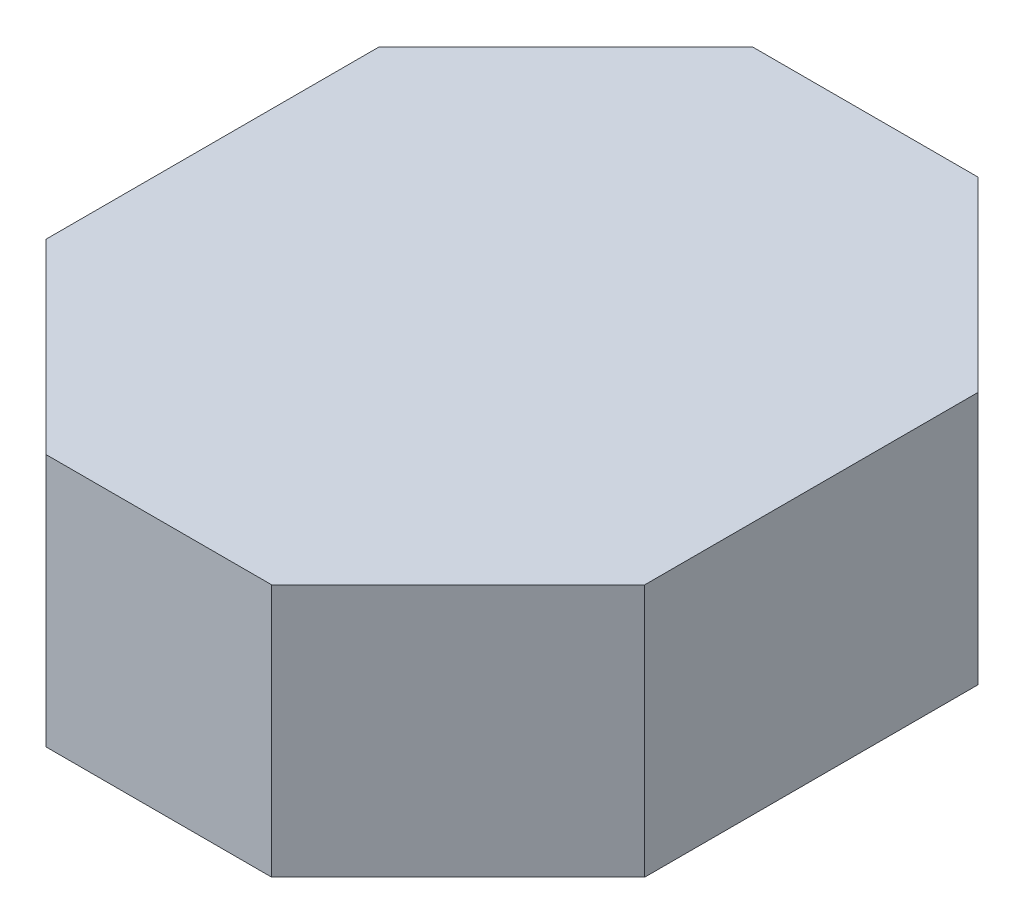
ISO-10303-21;
HEADER;
FILE_DESCRIPTION(('STEP AP214'),'2;1');
FILE_NAME('part.step','',(''),(''),'','','');
FILE_SCHEMA(('AUTOMOTIVE_DESIGN { 1 0 10303 214 1 1 1 1 }'));
ENDSEC;
DATA;
#1=APPLICATION_CONTEXT('core data for automotive mechanical design processes');
#2=APPLICATION_PROTOCOL_DEFINITION('international standard','automotive_design',2000,#1);
#3=PRODUCT_CONTEXT('',#1,'mechanical');
#4=PRODUCT('Part','Part','',(#3));
#5=PRODUCT_RELATED_PRODUCT_CATEGORY('part','',(#4));
#6=PRODUCT_DEFINITION_FORMATION('','',#4);
#7=PRODUCT_DEFINITION_CONTEXT('part definition',#1,'design');
#8=PRODUCT_DEFINITION('design','',#6,#7);
#9=PRODUCT_DEFINITION_SHAPE('','',#8);
#10=(LENGTH_UNIT() NAMED_UNIT(*) SI_UNIT(.MILLI.,.METRE.));
#11=(NAMED_UNIT(*) PLANE_ANGLE_UNIT() SI_UNIT($,.RADIAN.));
#12=(NAMED_UNIT(*) SI_UNIT($,.STERADIAN.) SOLID_ANGLE_UNIT());
#13=UNCERTAINTY_MEASURE_WITH_UNIT(LENGTH_MEASURE(1.E-05),#10,'distance_accuracy_value','');
#14=(GEOMETRIC_REPRESENTATION_CONTEXT(3) GLOBAL_UNCERTAINTY_ASSIGNED_CONTEXT((#13)) GLOBAL_UNIT_ASSIGNED_CONTEXT((#10,
#11,#12)) REPRESENTATION_CONTEXT('',''));
#15=CARTESIAN_POINT('',(0.,0.,0.));
#16=DIRECTION('',(0.,0.,1.));
#17=DIRECTION('',(1.,0.,0.));
#18=AXIS2_PLACEMENT_3D('',#15,#16,#17);
#19=CARTESIAN_POINT('',(69.6568542494926,80.,219.137084989847));
#20=DIRECTION('',(0.,0.,1.));
#21=DIRECTION('',(1.,0.,0.));
#22=AXIS2_PLACEMENT_3D('',#19,#20,#21);
#23=PLANE('',#22);
#24=DIRECTION('',(-1.,0.,0.));
#25=VECTOR('',#24,1.);
#26=CARTESIAN_POINT('',(69.6568542494926,0.,219.137084989847));
#27=LINE('',#26,#25);
#28=CARTESIAN_POINT('',(69.6568542494926,0.,219.137084989847));
#29=VERTEX_POINT('',#28);
#30=CARTESIAN_POINT('',(-1.65685424949194,0.,219.137084989847));
#31=VERTEX_POINT('',#30);
#32=EDGE_CURVE('E158',#29,#31,#27,.T.);
#33=ORIENTED_EDGE('',*,*,#32,.F.);
#34=DIRECTION('',(0.,-1.,0.));
#35=VECTOR('',#34,1.);
#36=CARTESIAN_POINT('',(69.6568542494926,80.,219.137084989847));
#37=LINE('',#36,#35);
#38=CARTESIAN_POINT('',(69.6568542494926,80.,219.137084989847));
#39=VERTEX_POINT('',#38);
#40=EDGE_CURVE('E11',#39,#29,#37,.T.);
#41=ORIENTED_EDGE('',*,*,#40,.F.);
#42=DIRECTION('',(-1.,0.,0.));
#43=VECTOR('',#42,1.);
#44=CARTESIAN_POINT('',(69.6568542494926,80.,219.137084989847));
#45=LINE('',#44,#43);
#46=CARTESIAN_POINT('',(-1.65685424949194,80.,219.137084989847));
#47=VERTEX_POINT('',#46);
#48=EDGE_CURVE('E187',#39,#47,#45,.T.);
#49=ORIENTED_EDGE('',*,*,#48,.T.);
#50=DIRECTION('',(0.,-1.,0.));
#51=VECTOR('',#50,1.);
#52=CARTESIAN_POINT('',(-1.65685424949194,80.,219.137084989847));
#53=LINE('',#52,#51);
#54=EDGE_CURVE('E45',#47,#31,#53,.T.);
#55=ORIENTED_EDGE('',*,*,#54,.T.);
#56=EDGE_LOOP('',(#33,#41,#49,#55));
#57=FACE_BOUND('',#56,.T.);
#58=ADVANCED_FACE('F42',(#57),#23,.T.);
#59=CARTESIAN_POINT('',(128.568542494924,80.,160.225396744416));
#60=DIRECTION('',(0.707106781186548,0.,0.707106781186548));
#61=DIRECTION('',(0.707106781186548,0.,-0.707106781186548));
#62=AXIS2_PLACEMENT_3D('',#59,#60,#61);
#63=PLANE('',#62);
#64=DIRECTION('',(-0.707106781186547,0.,0.707106781186547));
#65=VECTOR('',#64,1.);
#66=CARTESIAN_POINT('',(128.568542494924,0.,160.225396744416));
#67=LINE('',#66,#65);
#68=CARTESIAN_POINT('',(128.568542494924,0.,160.225396744416));
#69=VERTEX_POINT('',#68);
#70=EDGE_CURVE('E184',#69,#29,#67,.T.);
#71=ORIENTED_EDGE('',*,*,#70,.F.);
#72=DIRECTION('',(0.,-1.,0.));
#73=VECTOR('',#72,1.);
#74=CARTESIAN_POINT('',(128.568542494924,80.,160.225396744416));
#75=LINE('',#74,#73);
#76=CARTESIAN_POINT('',(128.568542494924,80.,160.225396744416));
#77=VERTEX_POINT('',#76);
#78=EDGE_CURVE('E51',#77,#69,#75,.T.);
#79=ORIENTED_EDGE('',*,*,#78,.F.);
#80=DIRECTION('',(-0.707106781186547,0.,0.707106781186547));
#81=VECTOR('',#80,1.);
#82=CARTESIAN_POINT('',(128.568542494924,80.,160.225396744416));
#83=LINE('',#82,#81);
#84=EDGE_CURVE('E144',#77,#39,#83,.T.);
#85=ORIENTED_EDGE('',*,*,#84,.T.);
#86=ORIENTED_EDGE('',*,*,#40,.T.);
#87=EDGE_LOOP('',(#71,#79,#85,#86));
#88=FACE_BOUND('',#87,.T.);
#89=ADVANCED_FACE('F205',(#88),#63,.T.);
#90=CARTESIAN_POINT('',(128.568542494924,80.,54.9116882454311));
#91=DIRECTION('',(1.,0.,0.));
#92=DIRECTION('',(0.,0.,-1.));
#93=AXIS2_PLACEMENT_3D('',#90,#91,#92);
#94=PLANE('',#93);
#95=DIRECTION('',(0.,0.,1.));
#96=VECTOR('',#95,1.);
#97=CARTESIAN_POINT('',(128.568542494924,0.,54.9116882454311));
#98=LINE('',#97,#96);
#99=CARTESIAN_POINT('',(128.568542494924,0.,54.9116882454311));
#100=VERTEX_POINT('',#99);
#101=EDGE_CURVE('E130',#100,#69,#98,.T.);
#102=ORIENTED_EDGE('',*,*,#101,.F.);
#103=DIRECTION('',(0.,-1.,0.));
#104=VECTOR('',#103,1.);
#105=CARTESIAN_POINT('',(128.568542494924,80.,54.9116882454311));
#106=LINE('',#105,#104);
#107=CARTESIAN_POINT('',(128.568542494924,80.,54.9116882454311));
#108=VERTEX_POINT('',#107);
#109=EDGE_CURVE('E124',#108,#100,#106,.T.);
#110=ORIENTED_EDGE('',*,*,#109,.F.);
#111=DIRECTION('',(0.,0.,1.));
#112=VECTOR('',#111,1.);
#113=CARTESIAN_POINT('',(128.568542494924,80.,54.9116882454311));
#114=LINE('',#113,#112);
#115=EDGE_CURVE('E127',#108,#77,#114,.T.);
#116=ORIENTED_EDGE('',*,*,#115,.T.);
#117=ORIENTED_EDGE('',*,*,#78,.T.);
#118=EDGE_LOOP('',(#102,#110,#116,#117));
#119=FACE_BOUND('',#118,.T.);
#120=ADVANCED_FACE('F126',(#119),#94,.T.);
#121=CARTESIAN_POINT('',(69.6568542494924,80.,-4.));
#122=DIRECTION('',(0.707106781186544,0.,-0.707106781186551));
#123=DIRECTION('',(-0.707106781186551,0.,-0.707106781186544));
#124=AXIS2_PLACEMENT_3D('',#121,#122,#123);
#125=PLANE('',#124);
#126=DIRECTION('',(0.707106781186551,0.,0.707106781186544));
#127=VECTOR('',#126,1.);
#128=CARTESIAN_POINT('',(69.6568542494924,0.,-4.));
#129=LINE('',#128,#127);
#130=CARTESIAN_POINT('',(69.6568542494924,0.,-4.));
#131=VERTEX_POINT('',#130);
#132=EDGE_CURVE('E179',#131,#100,#129,.T.);
#133=ORIENTED_EDGE('',*,*,#132,.F.);
#134=DIRECTION('',(0.,-1.,0.));
#135=VECTOR('',#134,1.);
#136=CARTESIAN_POINT('',(69.6568542494924,80.,-4.));
#137=LINE('',#136,#135);
#138=CARTESIAN_POINT('',(69.6568542494924,80.,-4.));
#139=VERTEX_POINT('',#138);
#140=EDGE_CURVE('E136',#139,#131,#137,.T.);
#141=ORIENTED_EDGE('',*,*,#140,.F.);
#142=DIRECTION('',(0.707106781186551,0.,0.707106781186544));
#143=VECTOR('',#142,1.);
#144=CARTESIAN_POINT('',(69.6568542494924,80.,-4.));
#145=LINE('',#144,#143);
#146=EDGE_CURVE('E142',#139,#108,#145,.T.);
#147=ORIENTED_EDGE('',*,*,#146,.T.);
#148=ORIENTED_EDGE('',*,*,#109,.T.);
#149=EDGE_LOOP('',(#133,#141,#147,#148));
#150=FACE_BOUND('',#149,.T.);
#151=ADVANCED_FACE('F147',(#150),#125,.T.);
#152=CARTESIAN_POINT('',(-1.65685424949214,80.,-4.));
#153=DIRECTION('',(0.,0.,-1.));
#154=DIRECTION('',(-1.,0.,0.));
#155=AXIS2_PLACEMENT_3D('',#152,#153,#154);
#156=PLANE('',#155);
#157=DIRECTION('',(1.,0.,0.));
#158=VECTOR('',#157,1.);
#159=CARTESIAN_POINT('',(-1.65685424949214,0.,-4.));
#160=LINE('',#159,#158);
#161=CARTESIAN_POINT('',(-1.65685424949214,0.,-4.));
#162=VERTEX_POINT('',#161);
#163=EDGE_CURVE('E175',#162,#131,#160,.T.);
#164=ORIENTED_EDGE('',*,*,#163,.F.);
#165=DIRECTION('',(0.,-1.,0.));
#166=VECTOR('',#165,1.);
#167=CARTESIAN_POINT('',(-1.65685424949214,80.,-4.));
#168=LINE('',#167,#166);
#169=CARTESIAN_POINT('',(-1.65685424949214,80.,-4.));
#170=VERTEX_POINT('',#169);
#171=EDGE_CURVE('E193',#170,#162,#168,.T.);
#172=ORIENTED_EDGE('',*,*,#171,.F.);
#173=DIRECTION('',(1.,0.,0.));
#174=VECTOR('',#173,1.);
#175=CARTESIAN_POINT('',(-1.65685424949214,80.,-4.));
#176=LINE('',#175,#174);
#177=EDGE_CURVE('E149',#170,#139,#176,.T.);
#178=ORIENTED_EDGE('',*,*,#177,.T.);
#179=ORIENTED_EDGE('',*,*,#140,.T.);
#180=EDGE_LOOP('',(#164,#172,#178,#179));
#181=FACE_BOUND('',#180,.T.);
#182=ADVANCED_FACE('F218',(#181),#156,.T.);
#183=CARTESIAN_POINT('',(-60.5685424949237,80.,54.9116882454315));
#184=DIRECTION('',(-0.707106781186547,0.,-0.707106781186548));
#185=DIRECTION('',(-0.707106781186548,0.,0.707106781186547));
#186=AXIS2_PLACEMENT_3D('',#183,#184,#185);
#187=PLANE('',#186);
#188=DIRECTION('',(0.707106781186548,0.,-0.707106781186547));
#189=VECTOR('',#188,1.);
#190=CARTESIAN_POINT('',(-60.5685424949237,0.,54.9116882454315));
#191=LINE('',#190,#189);
#192=CARTESIAN_POINT('',(-60.5685424949237,0.,54.9116882454315));
#193=VERTEX_POINT('',#192);
#194=EDGE_CURVE('E171',#193,#162,#191,.T.);
#195=ORIENTED_EDGE('',*,*,#194,.F.);
#196=DIRECTION('',(0.,-1.,0.));
#197=VECTOR('',#196,1.);
#198=CARTESIAN_POINT('',(-60.5685424949237,80.,54.9116882454315));
#199=LINE('',#198,#197);
#200=CARTESIAN_POINT('',(-60.5685424949237,80.,54.9116882454315));
#201=VERTEX_POINT('',#200);
#202=EDGE_CURVE('E196',#201,#193,#199,.T.);
#203=ORIENTED_EDGE('',*,*,#202,.F.);
#204=DIRECTION('',(0.707106781186548,0.,-0.707106781186547));
#205=VECTOR('',#204,1.);
#206=CARTESIAN_POINT('',(-60.5685424949237,80.,54.9116882454315));
#207=LINE('',#206,#205);
#208=EDGE_CURVE('E152',#201,#170,#207,.T.);
#209=ORIENTED_EDGE('',*,*,#208,.T.);
#210=ORIENTED_EDGE('',*,*,#171,.T.);
#211=EDGE_LOOP('',(#195,#203,#209,#210));
#212=FACE_BOUND('',#211,.T.);
#213=ADVANCED_FACE('F221',(#212),#187,.T.);
#214=CARTESIAN_POINT('',(-60.5685424949237,80.,160.225396744416));
#215=DIRECTION('',(-1.,0.,0.));
#216=DIRECTION('',(0.,0.,1.));
#217=AXIS2_PLACEMENT_3D('',#214,#215,#216);
#218=PLANE('',#217);
#219=DIRECTION('',(0.,0.,-1.));
#220=VECTOR('',#219,1.);
#221=CARTESIAN_POINT('',(-60.5685424949237,0.,160.225396744416));
#222=LINE('',#221,#220);
#223=CARTESIAN_POINT('',(-60.5685424949237,0.,160.225396744416));
#224=VERTEX_POINT('',#223);
#225=EDGE_CURVE('E167',#224,#193,#222,.T.);
#226=ORIENTED_EDGE('',*,*,#225,.F.);
#227=DIRECTION('',(0.,-1.,0.));
#228=VECTOR('',#227,1.);
#229=CARTESIAN_POINT('',(-60.5685424949237,80.,160.225396744416));
#230=LINE('',#229,#228);
#231=CARTESIAN_POINT('',(-60.5685424949237,80.,160.225396744416));
#232=VERTEX_POINT('',#231);
#233=EDGE_CURVE('E198',#232,#224,#230,.T.);
#234=ORIENTED_EDGE('',*,*,#233,.F.);
#235=DIRECTION('',(0.,0.,-1.));
#236=VECTOR('',#235,1.);
#237=CARTESIAN_POINT('',(-60.5685424949237,80.,160.225396744416));
#238=LINE('',#237,#236);
#239=EDGE_CURVE('E377',#232,#201,#238,.T.);
#240=ORIENTED_EDGE('',*,*,#239,.T.);
#241=ORIENTED_EDGE('',*,*,#202,.T.);
#242=EDGE_LOOP('',(#226,#234,#240,#241));
#243=FACE_BOUND('',#242,.T.);
#244=ADVANCED_FACE('F225',(#243),#218,.T.);
#245=CARTESIAN_POINT('',(-1.65685424949194,80.,219.137084989847));
#246=DIRECTION('',(-0.707106781186544,0.,0.707106781186551));
#247=DIRECTION('',(0.707106781186551,0.,0.707106781186544));
#248=AXIS2_PLACEMENT_3D('',#245,#246,#247);
#249=PLANE('',#248);
#250=DIRECTION('',(-0.707106781186552,0.,-0.707106781186544));
#251=VECTOR('',#250,1.);
#252=CARTESIAN_POINT('',(-1.65685424949194,0.,219.137084989847));
#253=LINE('',#252,#251);
#254=EDGE_CURVE('E162',#31,#224,#253,.T.);
#255=ORIENTED_EDGE('',*,*,#254,.F.);
#256=ORIENTED_EDGE('',*,*,#54,.F.);
#257=DIRECTION('',(-0.707106781186552,0.,-0.707106781186544));
#258=VECTOR('',#257,1.);
#259=CARTESIAN_POINT('',(-1.65685424949194,80.,219.137084989847));
#260=LINE('',#259,#258);
#261=EDGE_CURVE('E374',#47,#232,#260,.T.);
#262=ORIENTED_EDGE('',*,*,#261,.T.);
#263=ORIENTED_EDGE('',*,*,#233,.T.);
#264=EDGE_LOOP('',(#255,#256,#262,#263));
#265=FACE_BOUND('',#264,.T.);
#266=ADVANCED_FACE('F202',(#265),#249,.T.);
#267=CARTESIAN_POINT('',(0.,80.,0.));
#268=DIRECTION('',(0.,-1.,0.));
#269=DIRECTION('',(0.,0.,-1.));
#270=AXIS2_PLACEMENT_3D('',#267,#268,#269);
#271=PLANE('',#270);
#272=ORIENTED_EDGE('',*,*,#48,.F.);
#273=ORIENTED_EDGE('',*,*,#84,.F.);
#274=ORIENTED_EDGE('',*,*,#115,.F.);
#275=ORIENTED_EDGE('',*,*,#146,.F.);
#276=ORIENTED_EDGE('',*,*,#177,.F.);
#277=ORIENTED_EDGE('',*,*,#208,.F.);
#278=ORIENTED_EDGE('',*,*,#239,.F.);
#279=ORIENTED_EDGE('',*,*,#261,.F.);
#280=EDGE_LOOP('',(#272,#273,#274,#275,#276,#277,#278,#279));
#281=FACE_BOUND('',#280,.T.);
#282=ADVANCED_FACE('F140',(#281),#271,.F.);
#283=CARTESIAN_POINT('',(0.,0.,0.));
#284=DIRECTION('',(0.,-1.,0.));
#285=DIRECTION('',(0.,0.,-1.));
#286=AXIS2_PLACEMENT_3D('',#283,#284,#285);
#287=PLANE('',#286);
#288=DIRECTION('',(0.707106781186551,0.,0.707106781186544));
#289=VECTOR('',#288,1.);
#290=CARTESIAN_POINT('',(68.8284271247462,0.,-2.));
#291=LINE('',#290,#289);
#292=CARTESIAN_POINT('',(68.8284271247462,0.,-2.));
#293=VERTEX_POINT('',#292);
#294=CARTESIAN_POINT('',(126.568542494924,0.,55.7401153701773));
#295=VERTEX_POINT('',#294);
#296=EDGE_CURVE('E59',#293,#295,#291,.T.);
#297=ORIENTED_EDGE('',*,*,#296,.F.);
#298=DIRECTION('',(1.,0.,0.));
#299=VECTOR('',#298,1.);
#300=CARTESIAN_POINT('',(-0.828427124745954,0.,-2.));
#301=LINE('',#300,#299);
#302=CARTESIAN_POINT('',(-0.828427124745954,0.,-2.));
#303=VERTEX_POINT('',#302);
#304=EDGE_CURVE('E289',#303,#293,#301,.T.);
#305=ORIENTED_EDGE('',*,*,#304,.F.);
#306=DIRECTION('',(0.707106781186547,0.,-0.707106781186547));
#307=VECTOR('',#306,1.);
#308=CARTESIAN_POINT('',(-58.5685424949237,0.,55.7401153701777));
#309=LINE('',#308,#307);
#310=CARTESIAN_POINT('',(-58.5685424949237,0.,55.7401153701777));
#311=VERTEX_POINT('',#310);
#312=EDGE_CURVE('E296',#311,#303,#309,.T.);
#313=ORIENTED_EDGE('',*,*,#312,.F.);
#314=DIRECTION('',(0.,0.,-1.));
#315=VECTOR('',#314,1.);
#316=CARTESIAN_POINT('',(-58.5685424949237,0.,159.39696961967));
#317=LINE('',#316,#315);
#318=CARTESIAN_POINT('',(-58.5685424949237,0.,159.39696961967));
#319=VERTEX_POINT('',#318);
#320=EDGE_CURVE('E337',#319,#311,#317,.T.);
#321=ORIENTED_EDGE('',*,*,#320,.F.);
#322=DIRECTION('',(-0.707106781186551,0.,-0.707106781186544));
#323=VECTOR('',#322,1.);
#324=CARTESIAN_POINT('',(-0.828427124745748,0.,217.137084989847));
#325=LINE('',#324,#323);
#326=CARTESIAN_POINT('',(-0.828427124745748,0.,217.137084989847));
#327=VERTEX_POINT('',#326);
#328=EDGE_CURVE('E333',#327,#319,#325,.T.);
#329=ORIENTED_EDGE('',*,*,#328,.F.);
#330=DIRECTION('',(-1.,0.,0.));
#331=VECTOR('',#330,1.);
#332=CARTESIAN_POINT('',(68.8284271247464,0.,217.137084989847));
#333=LINE('',#332,#331);
#334=CARTESIAN_POINT('',(68.8284271247464,0.,217.137084989847));
#335=VERTEX_POINT('',#334);
#336=EDGE_CURVE('E329',#335,#327,#333,.T.);
#337=ORIENTED_EDGE('',*,*,#336,.F.);
#338=DIRECTION('',(-0.707106781186547,0.,0.707106781186547));
#339=VECTOR('',#338,1.);
#340=CARTESIAN_POINT('',(126.568542494924,0.,159.39696961967));
#341=LINE('',#340,#339);
#342=CARTESIAN_POINT('',(126.568542494924,0.,159.39696961967));
#343=VERTEX_POINT('',#342);
#344=EDGE_CURVE('E325',#343,#335,#341,.T.);
#345=ORIENTED_EDGE('',*,*,#344,.F.);
#346=DIRECTION('',(0.,0.,1.));
#347=VECTOR('',#346,1.);
#348=CARTESIAN_POINT('',(126.568542494924,0.,55.7401153701773));
#349=LINE('',#348,#347);
#350=EDGE_CURVE('E321',#295,#343,#349,.T.);
#351=ORIENTED_EDGE('',*,*,#350,.F.);
#352=EDGE_LOOP('',(#297,#305,#313,#321,#329,#337,#345,#351));
#353=FACE_BOUND('',#352,.T.);
#354=ORIENTED_EDGE('',*,*,#32,.T.);
#355=ORIENTED_EDGE('',*,*,#254,.T.);
#356=ORIENTED_EDGE('',*,*,#225,.T.);
#357=ORIENTED_EDGE('',*,*,#194,.T.);
#358=ORIENTED_EDGE('',*,*,#163,.T.);
#359=ORIENTED_EDGE('',*,*,#132,.T.);
#360=ORIENTED_EDGE('',*,*,#101,.T.);
#361=ORIENTED_EDGE('',*,*,#70,.T.);
#362=EDGE_LOOP('',(#354,#355,#356,#357,#358,#359,#360,#361));
#363=FACE_BOUND('',#362,.T.);
#364=ADVANCED_FACE('F204',(#353,#363),#287,.T.);
#365=CARTESIAN_POINT('',(68.8284271247462,78.,-2.));
#366=DIRECTION('',(0.707106781186544,0.,-0.707106781186551));
#367=DIRECTION('',(-0.707106781186551,0.,-0.707106781186544));
#368=AXIS2_PLACEMENT_3D('',#365,#366,#367);
#369=PLANE('',#368);
#370=ORIENTED_EDGE('',*,*,#296,.T.);
#371=DIRECTION('',(0.,-1.,0.));
#372=VECTOR('',#371,1.);
#373=CARTESIAN_POINT('',(126.568542494924,78.,55.7401153701773));
#374=LINE('',#373,#372);
#375=CARTESIAN_POINT('',(126.568542494924,78.,55.7401153701773));
#376=VERTEX_POINT('',#375);
#377=EDGE_CURVE('E318',#376,#295,#374,.T.);
#378=ORIENTED_EDGE('',*,*,#377,.F.);
#379=DIRECTION('',(0.707106781186551,0.,0.707106781186544));
#380=VECTOR('',#379,1.);
#381=CARTESIAN_POINT('',(68.8284271247462,78.,-2.));
#382=LINE('',#381,#380);
#383=CARTESIAN_POINT('',(68.8284271247462,78.,-2.));
#384=VERTEX_POINT('',#383);
#385=EDGE_CURVE('E279',#384,#376,#382,.T.);
#386=ORIENTED_EDGE('',*,*,#385,.F.);
#387=DIRECTION('',(0.,-1.,0.));
#388=VECTOR('',#387,1.);
#389=CARTESIAN_POINT('',(68.8284271247462,78.,-2.));
#390=LINE('',#389,#388);
#391=EDGE_CURVE('E163',#384,#293,#390,.T.);
#392=ORIENTED_EDGE('',*,*,#391,.T.);
#393=EDGE_LOOP('',(#370,#378,#386,#392));
#394=FACE_BOUND('',#393,.T.);
#395=ADVANCED_FACE('F236',(#394),#369,.F.);
#396=CARTESIAN_POINT('',(-0.828427124745954,78.,-2.));
#397=DIRECTION('',(0.,0.,-1.));
#398=DIRECTION('',(-1.,0.,0.));
#399=AXIS2_PLACEMENT_3D('',#396,#397,#398);
#400=PLANE('',#399);
#401=ORIENTED_EDGE('',*,*,#304,.T.);
#402=ORIENTED_EDGE('',*,*,#391,.F.);
#403=DIRECTION('',(1.,0.,0.));
#404=VECTOR('',#403,1.);
#405=CARTESIAN_POINT('',(-0.828427124745954,78.,-2.));
#406=LINE('',#405,#404);
#407=CARTESIAN_POINT('',(-0.828427124745954,78.,-2.));
#408=VERTEX_POINT('',#407);
#409=EDGE_CURVE('E286',#408,#384,#406,.T.);
#410=ORIENTED_EDGE('',*,*,#409,.F.);
#411=DIRECTION('',(0.,-1.,0.));
#412=VECTOR('',#411,1.);
#413=CARTESIAN_POINT('',(-0.828427124745954,78.,-2.));
#414=LINE('',#413,#412);
#415=EDGE_CURVE('E346',#408,#303,#414,.T.);
#416=ORIENTED_EDGE('',*,*,#415,.T.);
#417=EDGE_LOOP('',(#401,#402,#410,#416));
#418=FACE_BOUND('',#417,.T.);
#419=ADVANCED_FACE('F241',(#418),#400,.F.);
#420=CARTESIAN_POINT('',(-58.5685424949237,78.,55.7401153701777));
#421=DIRECTION('',(-0.707106781186548,0.,-0.707106781186548));
#422=DIRECTION('',(-0.707106781186548,0.,0.707106781186548));
#423=AXIS2_PLACEMENT_3D('',#420,#421,#422);
#424=PLANE('',#423);
#425=ORIENTED_EDGE('',*,*,#312,.T.);
#426=ORIENTED_EDGE('',*,*,#415,.F.);
#427=DIRECTION('',(0.707106781186547,0.,-0.707106781186547));
#428=VECTOR('',#427,1.);
#429=CARTESIAN_POINT('',(-58.5685424949237,78.,55.7401153701777));
#430=LINE('',#429,#428);
#431=CARTESIAN_POINT('',(-58.5685424949237,78.,55.7401153701777));
#432=VERTEX_POINT('',#431);
#433=EDGE_CURVE('E313',#432,#408,#430,.T.);
#434=ORIENTED_EDGE('',*,*,#433,.F.);
#435=DIRECTION('',(0.,-1.,0.));
#436=VECTOR('',#435,1.);
#437=CARTESIAN_POINT('',(-58.5685424949237,78.,55.7401153701777));
#438=LINE('',#437,#436);
#439=EDGE_CURVE('E350',#432,#311,#438,.T.);
#440=ORIENTED_EDGE('',*,*,#439,.T.);
#441=EDGE_LOOP('',(#425,#426,#434,#440));
#442=FACE_BOUND('',#441,.T.);
#443=ADVANCED_FACE('F262',(#442),#424,.F.);
#444=CARTESIAN_POINT('',(-58.5685424949237,78.,159.39696961967));
#445=DIRECTION('',(-1.,0.,0.));
#446=DIRECTION('',(0.,0.,1.));
#447=AXIS2_PLACEMENT_3D('',#444,#445,#446);
#448=PLANE('',#447);
#449=ORIENTED_EDGE('',*,*,#320,.T.);
#450=ORIENTED_EDGE('',*,*,#439,.F.);
#451=DIRECTION('',(0.,0.,-1.));
#452=VECTOR('',#451,1.);
#453=CARTESIAN_POINT('',(-58.5685424949237,78.,159.39696961967));
#454=LINE('',#453,#452);
#455=CARTESIAN_POINT('',(-58.5685424949237,78.,159.39696961967));
#456=VERTEX_POINT('',#455);
#457=EDGE_CURVE('E309',#456,#432,#454,.T.);
#458=ORIENTED_EDGE('',*,*,#457,.F.);
#459=DIRECTION('',(0.,-1.,0.));
#460=VECTOR('',#459,1.);
#461=CARTESIAN_POINT('',(-58.5685424949237,78.,159.39696961967));
#462=LINE('',#461,#460);
#463=EDGE_CURVE('E354',#456,#319,#462,.T.);
#464=ORIENTED_EDGE('',*,*,#463,.T.);
#465=EDGE_LOOP('',(#449,#450,#458,#464));
#466=FACE_BOUND('',#465,.T.);
#467=ADVANCED_FACE('F258',(#466),#448,.F.);
#468=CARTESIAN_POINT('',(-0.828427124745748,78.,217.137084989847));
#469=DIRECTION('',(-0.707106781186544,0.,0.707106781186551));
#470=DIRECTION('',(0.707106781186551,0.,0.707106781186544));
#471=AXIS2_PLACEMENT_3D('',#468,#469,#470);
#472=PLANE('',#471);
#473=ORIENTED_EDGE('',*,*,#328,.T.);
#474=ORIENTED_EDGE('',*,*,#463,.F.);
#475=DIRECTION('',(-0.707106781186551,0.,-0.707106781186544));
#476=VECTOR('',#475,1.);
#477=CARTESIAN_POINT('',(-0.828427124745748,78.,217.137084989847));
#478=LINE('',#477,#476);
#479=CARTESIAN_POINT('',(-0.828427124745748,78.,217.137084989847));
#480=VERTEX_POINT('',#479);
#481=EDGE_CURVE('E305',#480,#456,#478,.T.);
#482=ORIENTED_EDGE('',*,*,#481,.F.);
#483=DIRECTION('',(0.,-1.,0.));
#484=VECTOR('',#483,1.);
#485=CARTESIAN_POINT('',(-0.828427124745748,78.,217.137084989847));
#486=LINE('',#485,#484);
#487=EDGE_CURVE('E358',#480,#327,#486,.T.);
#488=ORIENTED_EDGE('',*,*,#487,.T.);
#489=EDGE_LOOP('',(#473,#474,#482,#488));
#490=FACE_BOUND('',#489,.T.);
#491=ADVANCED_FACE('F254',(#490),#472,.F.);
#492=CARTESIAN_POINT('',(68.8284271247464,78.,217.137084989847));
#493=DIRECTION('',(0.,0.,1.));
#494=DIRECTION('',(1.,0.,0.));
#495=AXIS2_PLACEMENT_3D('',#492,#493,#494);
#496=PLANE('',#495);
#497=ORIENTED_EDGE('',*,*,#336,.T.);
#498=ORIENTED_EDGE('',*,*,#487,.F.);
#499=DIRECTION('',(-1.,0.,0.));
#500=VECTOR('',#499,1.);
#501=CARTESIAN_POINT('',(68.8284271247464,78.,217.137084989847));
#502=LINE('',#501,#500);
#503=CARTESIAN_POINT('',(68.8284271247464,78.,217.137084989847));
#504=VERTEX_POINT('',#503);
#505=EDGE_CURVE('E301',#504,#480,#502,.T.);
#506=ORIENTED_EDGE('',*,*,#505,.F.);
#507=DIRECTION('',(0.,-1.,0.));
#508=VECTOR('',#507,1.);
#509=CARTESIAN_POINT('',(68.8284271247464,78.,217.137084989847));
#510=LINE('',#509,#508);
#511=EDGE_CURVE('E362',#504,#335,#510,.T.);
#512=ORIENTED_EDGE('',*,*,#511,.T.);
#513=EDGE_LOOP('',(#497,#498,#506,#512));
#514=FACE_BOUND('',#513,.T.);
#515=ADVANCED_FACE('F250',(#514),#496,.F.);
#516=CARTESIAN_POINT('',(126.568542494924,78.,159.39696961967));
#517=DIRECTION('',(0.707106781186548,0.,0.707106781186548));
#518=DIRECTION('',(0.707106781186548,0.,-0.707106781186548));
#519=AXIS2_PLACEMENT_3D('',#516,#517,#518);
#520=PLANE('',#519);
#521=ORIENTED_EDGE('',*,*,#344,.T.);
#522=ORIENTED_EDGE('',*,*,#511,.F.);
#523=DIRECTION('',(-0.707106781186547,0.,0.707106781186547));
#524=VECTOR('',#523,1.);
#525=CARTESIAN_POINT('',(126.568542494924,78.,159.39696961967));
#526=LINE('',#525,#524);
#527=CARTESIAN_POINT('',(126.568542494924,78.,159.39696961967));
#528=VERTEX_POINT('',#527);
#529=EDGE_CURVE('E293',#528,#504,#526,.T.);
#530=ORIENTED_EDGE('',*,*,#529,.F.);
#531=DIRECTION('',(0.,-1.,0.));
#532=VECTOR('',#531,1.);
#533=CARTESIAN_POINT('',(126.568542494924,78.,159.39696961967));
#534=LINE('',#533,#532);
#535=EDGE_CURVE('E366',#528,#343,#534,.T.);
#536=ORIENTED_EDGE('',*,*,#535,.T.);
#537=EDGE_LOOP('',(#521,#522,#530,#536));
#538=FACE_BOUND('',#537,.T.);
#539=ADVANCED_FACE('F246',(#538),#520,.F.);
#540=CARTESIAN_POINT('',(126.568542494924,78.,55.7401153701773));
#541=DIRECTION('',(1.,0.,0.));
#542=DIRECTION('',(0.,0.,-1.));
#543=AXIS2_PLACEMENT_3D('',#540,#541,#542);
#544=PLANE('',#543);
#545=ORIENTED_EDGE('',*,*,#350,.T.);
#546=ORIENTED_EDGE('',*,*,#535,.F.);
#547=DIRECTION('',(0.,0.,1.));
#548=VECTOR('',#547,1.);
#549=CARTESIAN_POINT('',(126.568542494924,78.,55.7401153701773));
#550=LINE('',#549,#548);
#551=EDGE_CURVE('E283',#376,#528,#550,.T.);
#552=ORIENTED_EDGE('',*,*,#551,.F.);
#553=ORIENTED_EDGE('',*,*,#377,.T.);
#554=EDGE_LOOP('',(#545,#546,#552,#553));
#555=FACE_BOUND('',#554,.T.);
#556=ADVANCED_FACE('F242',(#555),#544,.F.);
#557=CARTESIAN_POINT('',(0.,78.,0.));
#558=DIRECTION('',(0.,-1.,0.));
#559=DIRECTION('',(0.,0.,-1.));
#560=AXIS2_PLACEMENT_3D('',#557,#558,#559);
#561=PLANE('',#560);
#562=ORIENTED_EDGE('',*,*,#385,.T.);
#563=ORIENTED_EDGE('',*,*,#551,.T.);
#564=ORIENTED_EDGE('',*,*,#529,.T.);
#565=ORIENTED_EDGE('',*,*,#505,.T.);
#566=ORIENTED_EDGE('',*,*,#481,.T.);
#567=ORIENTED_EDGE('',*,*,#457,.T.);
#568=ORIENTED_EDGE('',*,*,#433,.T.);
#569=ORIENTED_EDGE('',*,*,#409,.T.);
#570=EDGE_LOOP('',(#562,#563,#564,#565,#566,#567,#568,#569));
#571=FACE_BOUND('',#570,.T.);
#572=ADVANCED_FACE('F245',(#571),#561,.T.);
#573=CLOSED_SHELL('',(#58,#89,#120,#151,#182,#213,#244,#266,#282,#364,#395,#419,#443,#467,#491,
#515,#539,#556,#572));
#574=MANIFOLD_SOLID_BREP('B2',#573);
#575=ADVANCED_BREP_SHAPE_REPRESENTATION('',(#18,#574),#14);
#576=SHAPE_DEFINITION_REPRESENTATION(#9,#575);
ENDSEC;
END-ISO-10303-21;
